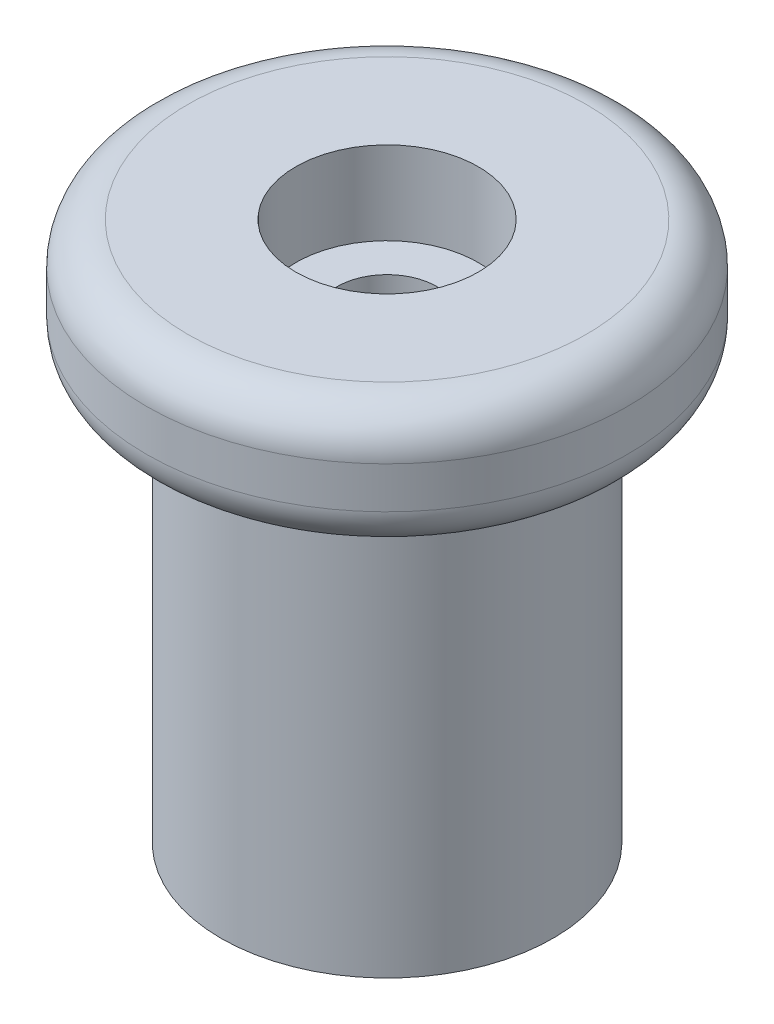
ISO-10303-21;
HEADER;
FILE_DESCRIPTION(('STEP AP214'),'2;1');
FILE_NAME('part.step','',(''),(''),'','','');
FILE_SCHEMA(('AUTOMOTIVE_DESIGN { 1 0 10303 214 1 1 1 1 }'));
ENDSEC;
DATA;
#1=APPLICATION_CONTEXT('core data for automotive mechanical design processes');
#2=APPLICATION_PROTOCOL_DEFINITION('international standard','automotive_design',2000,#1);
#3=PRODUCT_CONTEXT('',#1,'mechanical');
#4=PRODUCT('Part','Part','',(#3));
#5=PRODUCT_RELATED_PRODUCT_CATEGORY('part','',(#4));
#6=PRODUCT_DEFINITION_FORMATION('','',#4);
#7=PRODUCT_DEFINITION_CONTEXT('part definition',#1,'design');
#8=PRODUCT_DEFINITION('design','',#6,#7);
#9=PRODUCT_DEFINITION_SHAPE('','',#8);
#10=(LENGTH_UNIT() NAMED_UNIT(*) SI_UNIT(.MILLI.,.METRE.));
#11=(NAMED_UNIT(*) PLANE_ANGLE_UNIT() SI_UNIT($,.RADIAN.));
#12=(NAMED_UNIT(*) SI_UNIT($,.STERADIAN.) SOLID_ANGLE_UNIT());
#13=UNCERTAINTY_MEASURE_WITH_UNIT(LENGTH_MEASURE(1.E-05),#10,'distance_accuracy_value','');
#14=(GEOMETRIC_REPRESENTATION_CONTEXT(3) GLOBAL_UNCERTAINTY_ASSIGNED_CONTEXT((#13)) GLOBAL_UNIT_ASSIGNED_CONTEXT((#10,
#11,#12)) REPRESENTATION_CONTEXT('',''));
#15=CARTESIAN_POINT('',(0.,0.,0.));
#16=DIRECTION('',(0.,0.,1.));
#17=DIRECTION('',(1.,0.,0.));
#18=AXIS2_PLACEMENT_3D('',#15,#16,#17);
#19=CARTESIAN_POINT('',(0.,10.,0.));
#20=DIRECTION('',(0.,-1.,0.));
#21=DIRECTION('',(0.,0.,-1.));
#22=AXIS2_PLACEMENT_3D('',#19,#20,#21);
#23=CYLINDRICAL_SURFACE('',#22,4.);
#24=CARTESIAN_POINT('',(0.,10.,0.));
#25=DIRECTION('',(0.,1.,0.));
#26=DIRECTION('',(0.,0.,1.));
#27=AXIS2_PLACEMENT_3D('',#24,#25,#26);
#28=CIRCLE('',#27,4.);
#29=CARTESIAN_POINT('',(0.,10.,4.));
#30=VERTEX_POINT('',#29);
#31=EDGE_CURVE('E51',#30,#30,#28,.T.);
#32=ORIENTED_EDGE('',*,*,#31,.F.);
#33=EDGE_LOOP('',(#32));
#34=FACE_BOUND('',#33,.T.);
#35=CARTESIAN_POINT('',(0.,0.,0.));
#36=DIRECTION('',(0.,1.,0.));
#37=DIRECTION('',(0.,0.,1.));
#38=AXIS2_PLACEMENT_3D('',#35,#36,#37);
#39=CIRCLE('',#38,4.);
#40=CARTESIAN_POINT('',(0.,0.,4.));
#41=VERTEX_POINT('',#40);
#42=EDGE_CURVE('E52',#41,#41,#39,.T.);
#43=ORIENTED_EDGE('',*,*,#42,.T.);
#44=EDGE_LOOP('',(#43));
#45=FACE_BOUND('',#44,.T.);
#46=ADVANCED_FACE('F31',(#34,#45),#23,.T.);
#47=CARTESIAN_POINT('',(0.,0.,0.));
#48=DIRECTION('',(0.,1.,0.));
#49=DIRECTION('',(0.,0.,1.));
#50=AXIS2_PLACEMENT_3D('',#47,#48,#49);
#51=PLANE('',#50);
#52=CARTESIAN_POINT('',(0.,0.,0.));
#53=DIRECTION('',(0.,1.,0.));
#54=DIRECTION('',(0.,0.,1.));
#55=AXIS2_PLACEMENT_3D('',#52,#53,#54);
#56=CIRCLE('',#55,1.2);
#57=CARTESIAN_POINT('',(0.,0.,1.2));
#58=VERTEX_POINT('',#57);
#59=EDGE_CURVE('E55',#58,#58,#56,.T.);
#60=ORIENTED_EDGE('',*,*,#59,.T.);
#61=EDGE_LOOP('',(#60));
#62=FACE_BOUND('',#61,.T.);
#63=ORIENTED_EDGE('',*,*,#42,.F.);
#64=EDGE_LOOP('',(#63));
#65=FACE_BOUND('',#64,.T.);
#66=ADVANCED_FACE('F83',(#62,#65),#51,.F.);
#67=CARTESIAN_POINT('',(0.,13.,0.));
#68=DIRECTION('',(0.,-1.,0.));
#69=DIRECTION('',(0.,0.,-1.));
#70=AXIS2_PLACEMENT_3D('',#67,#68,#69);
#71=CYLINDRICAL_SURFACE('',#70,5.8);
#72=CARTESIAN_POINT('',(0.,11.,0.));
#73=DIRECTION('',(0.,1.,0.));
#74=DIRECTION('',(0.,0.,1.));
#75=AXIS2_PLACEMENT_3D('',#72,#73,#74);
#76=CIRCLE('',#75,5.8);
#77=CARTESIAN_POINT('',(0.,11.,5.8));
#78=VERTEX_POINT('',#77);
#79=EDGE_CURVE('E42',#78,#78,#76,.T.);
#80=ORIENTED_EDGE('',*,*,#79,.T.);
#81=EDGE_LOOP('',(#80));
#82=FACE_BOUND('',#81,.T.);
#83=CARTESIAN_POINT('',(0.,12.,0.));
#84=DIRECTION('',(0.,1.,0.));
#85=DIRECTION('',(0.,0.,1.));
#86=AXIS2_PLACEMENT_3D('',#83,#84,#85);
#87=CIRCLE('',#86,5.8);
#88=CARTESIAN_POINT('',(0.,12.,5.8));
#89=VERTEX_POINT('',#88);
#90=EDGE_CURVE('E46',#89,#89,#87,.F.);
#91=ORIENTED_EDGE('',*,*,#90,.T.);
#92=EDGE_LOOP('',(#91));
#93=FACE_BOUND('',#92,.T.);
#94=ADVANCED_FACE('F75',(#82,#93),#71,.T.);
#95=CARTESIAN_POINT('',(0.,13.,0.));
#96=DIRECTION('',(0.,1.,0.));
#97=DIRECTION('',(0.,0.,1.));
#98=AXIS2_PLACEMENT_3D('',#95,#96,#97);
#99=PLANE('',#98);
#100=CARTESIAN_POINT('',(0.,13.,0.));
#101=DIRECTION('',(0.,1.,0.));
#102=DIRECTION('',(0.,0.,1.));
#103=AXIS2_PLACEMENT_3D('',#100,#101,#102);
#104=CIRCLE('',#103,4.8);
#105=CARTESIAN_POINT('',(0.,13.,4.8));
#106=VERTEX_POINT('',#105);
#107=EDGE_CURVE('E10',#106,#106,#104,.T.);
#108=ORIENTED_EDGE('',*,*,#107,.T.);
#109=EDGE_LOOP('',(#108));
#110=FACE_BOUND('',#109,.T.);
#111=CARTESIAN_POINT('',(0.,13.,0.));
#112=DIRECTION('',(0.,1.,0.));
#113=DIRECTION('',(0.,0.,1.));
#114=AXIS2_PLACEMENT_3D('',#111,#112,#113);
#115=CIRCLE('',#114,2.19999999999999);
#116=CARTESIAN_POINT('',(0.,13.,2.19999999999999));
#117=VERTEX_POINT('',#116);
#118=EDGE_CURVE('E66',#117,#117,#115,.T.);
#119=ORIENTED_EDGE('',*,*,#118,.F.);
#120=EDGE_LOOP('',(#119));
#121=FACE_BOUND('',#120,.T.);
#122=ADVANCED_FACE('F72',(#110,#121),#99,.T.);
#123=CARTESIAN_POINT('',(0.,10.,0.));
#124=DIRECTION('',(0.,1.,0.));
#125=DIRECTION('',(0.,0.,1.));
#126=AXIS2_PLACEMENT_3D('',#123,#124,#125);
#127=PLANE('',#126);
#128=CARTESIAN_POINT('',(0.,10.,0.));
#129=DIRECTION('',(0.,1.,0.));
#130=DIRECTION('',(0.,0.,1.));
#131=AXIS2_PLACEMENT_3D('',#128,#129,#130);
#132=CIRCLE('',#131,4.8);
#133=CARTESIAN_POINT('',(0.,10.,4.8));
#134=VERTEX_POINT('',#133);
#135=EDGE_CURVE('E38',#134,#134,#132,.F.);
#136=ORIENTED_EDGE('',*,*,#135,.T.);
#137=EDGE_LOOP('',(#136));
#138=FACE_BOUND('',#137,.T.);
#139=ORIENTED_EDGE('',*,*,#31,.T.);
#140=EDGE_LOOP('',(#139));
#141=FACE_BOUND('',#140,.T.);
#142=ADVANCED_FACE('F74',(#138,#141),#127,.F.);
#143=CARTESIAN_POINT('',(0.,13.,0.));
#144=DIRECTION('',(0.,1.,0.));
#145=DIRECTION('',(0.,0.,1.));
#146=AXIS2_PLACEMENT_3D('',#143,#144,#145);
#147=CYLINDRICAL_SURFACE('',#146,1.2);
#148=ORIENTED_EDGE('',*,*,#59,.F.);
#149=EDGE_LOOP('',(#148));
#150=FACE_BOUND('',#149,.T.);
#151=CARTESIAN_POINT('',(0.,11.,0.));
#152=DIRECTION('',(0.,1.,0.));
#153=DIRECTION('',(0.,0.,1.));
#154=AXIS2_PLACEMENT_3D('',#151,#152,#153);
#155=CIRCLE('',#154,1.2);
#156=CARTESIAN_POINT('',(0.,11.,1.2));
#157=VERTEX_POINT('',#156);
#158=EDGE_CURVE('E60',#157,#157,#155,.T.);
#159=ORIENTED_EDGE('',*,*,#158,.T.);
#160=EDGE_LOOP('',(#159));
#161=FACE_BOUND('',#160,.T.);
#162=ADVANCED_FACE('F81',(#150,#161),#147,.F.);
#163=CARTESIAN_POINT('',(1.2,11.,0.));
#164=DIRECTION('',(0.,-1.,0.));
#165=DIRECTION('',(0.,0.,-1.));
#166=AXIS2_PLACEMENT_3D('',#163,#164,#165);
#167=PLANE('',#166);
#168=ORIENTED_EDGE('',*,*,#158,.F.);
#169=EDGE_LOOP('',(#168));
#170=FACE_BOUND('',#169,.T.);
#171=CARTESIAN_POINT('',(0.,11.,0.));
#172=DIRECTION('',(0.,1.,0.));
#173=DIRECTION('',(0.,0.,1.));
#174=AXIS2_PLACEMENT_3D('',#171,#172,#173);
#175=CIRCLE('',#174,2.2);
#176=CARTESIAN_POINT('',(0.,11.,2.2));
#177=VERTEX_POINT('',#176);
#178=EDGE_CURVE('E63',#177,#177,#175,.T.);
#179=ORIENTED_EDGE('',*,*,#178,.T.);
#180=EDGE_LOOP('',(#179));
#181=FACE_BOUND('',#180,.T.);
#182=ADVANCED_FACE('F105',(#170,#181),#167,.F.);
#183=CARTESIAN_POINT('',(0.,13.,0.));
#184=DIRECTION('',(0.,1.,0.));
#185=DIRECTION('',(0.,0.,1.));
#186=AXIS2_PLACEMENT_3D('',#183,#184,#185);
#187=CYLINDRICAL_SURFACE('',#186,2.19999999999999);
#188=ORIENTED_EDGE('',*,*,#178,.F.);
#189=EDGE_LOOP('',(#188));
#190=FACE_BOUND('',#189,.T.);
#191=ORIENTED_EDGE('',*,*,#118,.T.);
#192=EDGE_LOOP('',(#191));
#193=FACE_BOUND('',#192,.T.);
#194=ADVANCED_FACE('F70',(#190,#193),#187,.F.);
#195=CARTESIAN_POINT('',(0.,11.,0.));
#196=DIRECTION('',(0.,1.,0.));
#197=DIRECTION('',(0.,0.,1.));
#198=AXIS2_PLACEMENT_3D('',#195,#196,#197);
#199=TOROIDAL_SURFACE('',#198,4.8,1.);
#200=ORIENTED_EDGE('',*,*,#135,.F.);
#201=EDGE_LOOP('',(#200));
#202=FACE_BOUND('',#201,.T.);
#203=ORIENTED_EDGE('',*,*,#79,.F.);
#204=EDGE_LOOP('',(#203));
#205=FACE_BOUND('',#204,.T.);
#206=ADVANCED_FACE('F97',(#202,#205),#199,.T.);
#207=CARTESIAN_POINT('',(0.,12.,0.));
#208=DIRECTION('',(0.,1.,0.));
#209=DIRECTION('',(0.,0.,1.));
#210=AXIS2_PLACEMENT_3D('',#207,#208,#209);
#211=TOROIDAL_SURFACE('',#210,4.8,1.);
#212=ORIENTED_EDGE('',*,*,#90,.F.);
#213=EDGE_LOOP('',(#212));
#214=FACE_BOUND('',#213,.T.);
#215=ORIENTED_EDGE('',*,*,#107,.F.);
#216=EDGE_LOOP('',(#215));
#217=FACE_BOUND('',#216,.T.);
#218=ADVANCED_FACE('F33',(#214,#217),#211,.T.);
#219=CLOSED_SHELL('',(#46,#66,#94,#122,#142,#162,#182,#194,#206,#218));
#220=MANIFOLD_SOLID_BREP('B2',#219);
#221=ADVANCED_BREP_SHAPE_REPRESENTATION('',(#18,#220),#14);
#222=SHAPE_DEFINITION_REPRESENTATION(#9,#221);
ENDSEC;
END-ISO-10303-21;
